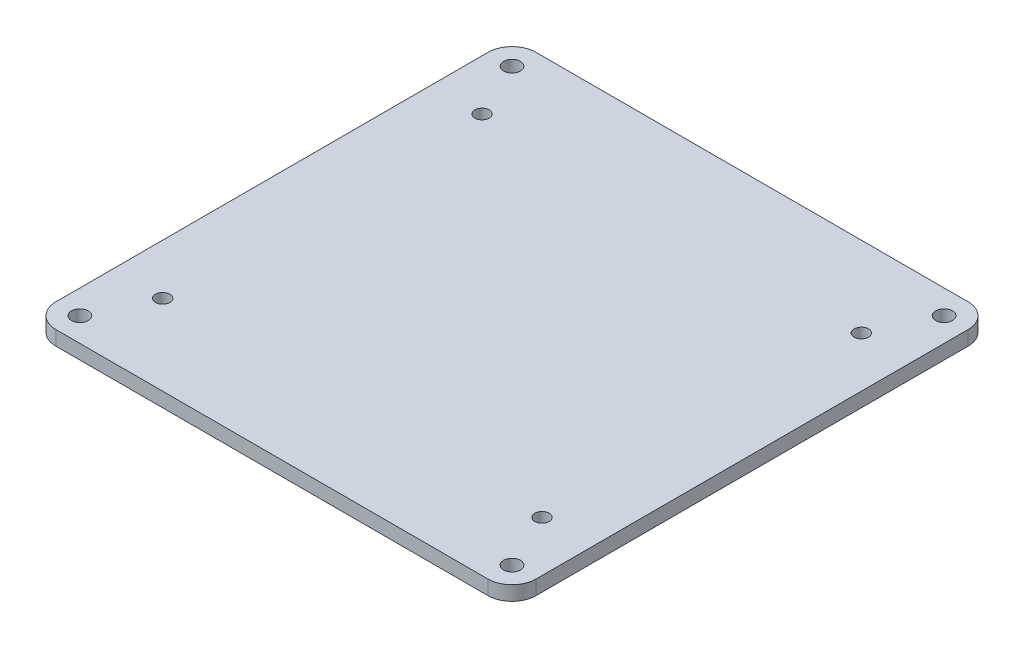
ISO-10303-21;
HEADER;
FILE_DESCRIPTION(('STEP AP214'),'2;1');
FILE_NAME('part.step','',(''),(''),'','','');
FILE_SCHEMA(('AUTOMOTIVE_DESIGN { 1 0 10303 214 1 1 1 1 }'));
ENDSEC;
DATA;
#1=APPLICATION_CONTEXT('core data for automotive mechanical design processes');
#2=APPLICATION_PROTOCOL_DEFINITION('international standard','automotive_design',2000,#1);
#3=PRODUCT_CONTEXT('',#1,'mechanical');
#4=PRODUCT('Part','Part','',(#3));
#5=PRODUCT_RELATED_PRODUCT_CATEGORY('part','',(#4));
#6=PRODUCT_DEFINITION_FORMATION('','',#4);
#7=PRODUCT_DEFINITION_CONTEXT('part definition',#1,'design');
#8=PRODUCT_DEFINITION('design','',#6,#7);
#9=PRODUCT_DEFINITION_SHAPE('','',#8);
#10=(LENGTH_UNIT() NAMED_UNIT(*) SI_UNIT(.MILLI.,.METRE.));
#11=(NAMED_UNIT(*) PLANE_ANGLE_UNIT() SI_UNIT($,.RADIAN.));
#12=(NAMED_UNIT(*) SI_UNIT($,.STERADIAN.) SOLID_ANGLE_UNIT());
#13=UNCERTAINTY_MEASURE_WITH_UNIT(LENGTH_MEASURE(1.E-05),#10,'distance_accuracy_value','');
#14=(GEOMETRIC_REPRESENTATION_CONTEXT(3) GLOBAL_UNCERTAINTY_ASSIGNED_CONTEXT((#13)) GLOBAL_UNIT_ASSIGNED_CONTEXT((#10,
#11,#12)) REPRESENTATION_CONTEXT('',''));
#15=CARTESIAN_POINT('',(0.,0.,0.));
#16=DIRECTION('',(0.,0.,1.));
#17=DIRECTION('',(1.,0.,0.));
#18=AXIS2_PLACEMENT_3D('',#15,#16,#17);
#19=CARTESIAN_POINT('',(45.,3.,45.));
#20=DIRECTION('',(0.,-1.,0.));
#21=DIRECTION('',(0.,0.,-1.));
#22=AXIS2_PLACEMENT_3D('',#19,#20,#21);
#23=PLANE('',#22);
#24=CARTESIAN_POINT('',(45.,3.,45.));
#25=DIRECTION('',(0.,1.,0.));
#26=DIRECTION('',(0.,0.,-1.));
#27=AXIS2_PLACEMENT_3D('',#24,#25,#26);
#28=CIRCLE('',#27,4.99999999999999);
#29=CARTESIAN_POINT('',(45.,3.,50.));
#30=VERTEX_POINT('',#29);
#31=CARTESIAN_POINT('',(50.,3.,45.));
#32=VERTEX_POINT('',#31);
#33=EDGE_CURVE('E147',#30,#32,#28,.T.);
#34=ORIENTED_EDGE('',*,*,#33,.T.);
#35=DIRECTION('',(0.,0.,-1.));
#36=VECTOR('',#35,1.);
#37=CARTESIAN_POINT('',(50.,3.,-45.));
#38=LINE('',#37,#36);
#39=CARTESIAN_POINT('',(50.,3.,-45.));
#40=VERTEX_POINT('',#39);
#41=EDGE_CURVE('E95',#32,#40,#38,.T.);
#42=ORIENTED_EDGE('',*,*,#41,.T.);
#43=CARTESIAN_POINT('',(45.,3.,-45.));
#44=DIRECTION('',(0.,1.,0.));
#45=DIRECTION('',(0.,0.,-1.));
#46=AXIS2_PLACEMENT_3D('',#43,#44,#45);
#47=CIRCLE('',#46,5.);
#48=CARTESIAN_POINT('',(45.,3.,-50.));
#49=VERTEX_POINT('',#48);
#50=EDGE_CURVE('E162',#40,#49,#47,.T.);
#51=ORIENTED_EDGE('',*,*,#50,.T.);
#52=DIRECTION('',(-1.,0.,0.));
#53=VECTOR('',#52,1.);
#54=CARTESIAN_POINT('',(-45.,3.,-50.));
#55=LINE('',#54,#53);
#56=CARTESIAN_POINT('',(-45.,3.,-50.));
#57=VERTEX_POINT('',#56);
#58=EDGE_CURVE('E175',#49,#57,#55,.T.);
#59=ORIENTED_EDGE('',*,*,#58,.T.);
#60=CARTESIAN_POINT('',(-45.,3.,-45.));
#61=DIRECTION('',(0.,1.,0.));
#62=DIRECTION('',(0.,0.,-1.));
#63=AXIS2_PLACEMENT_3D('',#60,#61,#62);
#64=CIRCLE('',#63,5.);
#65=CARTESIAN_POINT('',(-50.,3.,-45.));
#66=VERTEX_POINT('',#65);
#67=EDGE_CURVE('E114',#57,#66,#64,.T.);
#68=ORIENTED_EDGE('',*,*,#67,.T.);
#69=DIRECTION('',(0.,0.,1.));
#70=VECTOR('',#69,1.);
#71=CARTESIAN_POINT('',(-50.,3.,-45.));
#72=LINE('',#71,#70);
#73=CARTESIAN_POINT('',(-50.,3.,45.));
#74=VERTEX_POINT('',#73);
#75=EDGE_CURVE('E108',#66,#74,#72,.T.);
#76=ORIENTED_EDGE('',*,*,#75,.T.);
#77=CARTESIAN_POINT('',(-45.,3.,45.));
#78=DIRECTION('',(0.,1.,0.));
#79=DIRECTION('',(0.,0.,-1.));
#80=AXIS2_PLACEMENT_3D('',#77,#78,#79);
#81=CIRCLE('',#80,5.);
#82=CARTESIAN_POINT('',(-45.,3.,50.));
#83=VERTEX_POINT('',#82);
#84=EDGE_CURVE('E112',#74,#83,#81,.T.);
#85=ORIENTED_EDGE('',*,*,#84,.T.);
#86=DIRECTION('',(1.,0.,0.));
#87=VECTOR('',#86,1.);
#88=CARTESIAN_POINT('',(-45.,3.,50.));
#89=LINE('',#88,#87);
#90=EDGE_CURVE('E52',#83,#30,#89,.T.);
#91=ORIENTED_EDGE('',*,*,#90,.T.);
#92=EDGE_LOOP('',(#34,#42,#51,#59,#68,#76,#85,#91));
#93=FACE_BOUND('',#92,.T.);
#94=CARTESIAN_POINT('',(-45.,3.,-45.));
#95=DIRECTION('',(0.,1.,0.));
#96=DIRECTION('',(0.,0.,1.));
#97=AXIS2_PLACEMENT_3D('',#94,#95,#96);
#98=CIRCLE('',#97,1.75);
#99=CARTESIAN_POINT('',(-45.,3.,-43.25));
#100=VERTEX_POINT('',#99);
#101=EDGE_CURVE('E136',#100,#100,#98,.T.);
#102=ORIENTED_EDGE('',*,*,#101,.F.);
#103=EDGE_LOOP('',(#102));
#104=FACE_BOUND('',#103,.T.);
#105=CARTESIAN_POINT('',(45.,3.,-45.));
#106=DIRECTION('',(0.,1.,0.));
#107=DIRECTION('',(0.,0.,1.));
#108=AXIS2_PLACEMENT_3D('',#105,#106,#107);
#109=CIRCLE('',#108,1.75);
#110=CARTESIAN_POINT('',(45.,3.,-43.25));
#111=VERTEX_POINT('',#110);
#112=EDGE_CURVE('E184',#111,#111,#109,.T.);
#113=ORIENTED_EDGE('',*,*,#112,.F.);
#114=EDGE_LOOP('',(#113));
#115=FACE_BOUND('',#114,.T.);
#116=CARTESIAN_POINT('',(-45.,3.,45.));
#117=DIRECTION('',(0.,1.,0.));
#118=DIRECTION('',(0.,0.,1.));
#119=AXIS2_PLACEMENT_3D('',#116,#117,#118);
#120=CIRCLE('',#119,1.75);
#121=CARTESIAN_POINT('',(-45.,3.,46.75));
#122=VERTEX_POINT('',#121);
#123=EDGE_CURVE('E190',#122,#122,#120,.T.);
#124=ORIENTED_EDGE('',*,*,#123,.F.);
#125=EDGE_LOOP('',(#124));
#126=FACE_BOUND('',#125,.T.);
#127=CARTESIAN_POINT('',(45.,3.,45.));
#128=DIRECTION('',(0.,1.,0.));
#129=DIRECTION('',(0.,0.,1.));
#130=AXIS2_PLACEMENT_3D('',#127,#128,#129);
#131=CIRCLE('',#130,1.75);
#132=CARTESIAN_POINT('',(45.,3.,46.75));
#133=VERTEX_POINT('',#132);
#134=EDGE_CURVE('E196',#133,#133,#131,.T.);
#135=ORIENTED_EDGE('',*,*,#134,.F.);
#136=EDGE_LOOP('',(#135));
#137=FACE_BOUND('',#136,.T.);
#138=CARTESIAN_POINT('',(-39.5,3.,-33.25));
#139=DIRECTION('',(0.,1.,0.));
#140=DIRECTION('',(0.,0.,1.));
#141=AXIS2_PLACEMENT_3D('',#138,#139,#140);
#142=CIRCLE('',#141,1.5);
#143=CARTESIAN_POINT('',(-39.5,3.,-31.75));
#144=VERTEX_POINT('',#143);
#145=EDGE_CURVE('E202',#144,#144,#142,.T.);
#146=ORIENTED_EDGE('',*,*,#145,.F.);
#147=EDGE_LOOP('',(#146));
#148=FACE_BOUND('',#147,.T.);
#149=CARTESIAN_POINT('',(39.5,3.,-33.25));
#150=DIRECTION('',(0.,1.,0.));
#151=DIRECTION('',(0.,0.,1.));
#152=AXIS2_PLACEMENT_3D('',#149,#150,#151);
#153=CIRCLE('',#152,1.5);
#154=CARTESIAN_POINT('',(39.5,3.,-31.75));
#155=VERTEX_POINT('',#154);
#156=EDGE_CURVE('E208',#155,#155,#153,.T.);
#157=ORIENTED_EDGE('',*,*,#156,.F.);
#158=EDGE_LOOP('',(#157));
#159=FACE_BOUND('',#158,.T.);
#160=CARTESIAN_POINT('',(-39.5,3.,33.25));
#161=DIRECTION('',(0.,1.,0.));
#162=DIRECTION('',(0.,0.,1.));
#163=AXIS2_PLACEMENT_3D('',#160,#161,#162);
#164=CIRCLE('',#163,1.5);
#165=CARTESIAN_POINT('',(-39.5,3.,34.75));
#166=VERTEX_POINT('',#165);
#167=EDGE_CURVE('E214',#166,#166,#164,.T.);
#168=ORIENTED_EDGE('',*,*,#167,.F.);
#169=EDGE_LOOP('',(#168));
#170=FACE_BOUND('',#169,.T.);
#171=CARTESIAN_POINT('',(39.5,3.,33.25));
#172=DIRECTION('',(0.,1.,0.));
#173=DIRECTION('',(0.,0.,1.));
#174=AXIS2_PLACEMENT_3D('',#171,#172,#173);
#175=CIRCLE('',#174,1.5);
#176=CARTESIAN_POINT('',(39.5,3.,34.75));
#177=VERTEX_POINT('',#176);
#178=EDGE_CURVE('E220',#177,#177,#175,.T.);
#179=ORIENTED_EDGE('',*,*,#178,.F.);
#180=EDGE_LOOP('',(#179));
#181=FACE_BOUND('',#180,.T.);
#182=ADVANCED_FACE('F35',(#93,#104,#115,#126,#137,#148,#159,#170,#181),#23,.F.);
#183=CARTESIAN_POINT('',(45.,0.,45.));
#184=DIRECTION('',(0.,-1.,0.));
#185=DIRECTION('',(0.,0.,-1.));
#186=AXIS2_PLACEMENT_3D('',#183,#184,#185);
#187=PLANE('',#186);
#188=CARTESIAN_POINT('',(-39.5,0.,33.25));
#189=DIRECTION('',(0.,1.,0.));
#190=DIRECTION('',(0.,0.,1.));
#191=AXIS2_PLACEMENT_3D('',#188,#189,#190);
#192=CIRCLE('',#191,1.5);
#193=CARTESIAN_POINT('',(-39.5,0.,34.75));
#194=VERTEX_POINT('',#193);
#195=EDGE_CURVE('E217',#194,#194,#192,.T.);
#196=ORIENTED_EDGE('',*,*,#195,.T.);
#197=EDGE_LOOP('',(#196));
#198=FACE_BOUND('',#197,.T.);
#199=CARTESIAN_POINT('',(-39.5,0.,-33.25));
#200=DIRECTION('',(0.,1.,0.));
#201=DIRECTION('',(0.,0.,1.));
#202=AXIS2_PLACEMENT_3D('',#199,#200,#201);
#203=CIRCLE('',#202,1.5);
#204=CARTESIAN_POINT('',(-39.5,0.,-31.75));
#205=VERTEX_POINT('',#204);
#206=EDGE_CURVE('E205',#205,#205,#203,.T.);
#207=ORIENTED_EDGE('',*,*,#206,.T.);
#208=EDGE_LOOP('',(#207));
#209=FACE_BOUND('',#208,.T.);
#210=CARTESIAN_POINT('',(-45.,0.,45.));
#211=DIRECTION('',(0.,1.,0.));
#212=DIRECTION('',(0.,0.,1.));
#213=AXIS2_PLACEMENT_3D('',#210,#211,#212);
#214=CIRCLE('',#213,1.75);
#215=CARTESIAN_POINT('',(-45.,0.,46.75));
#216=VERTEX_POINT('',#215);
#217=EDGE_CURVE('E193',#216,#216,#214,.T.);
#218=ORIENTED_EDGE('',*,*,#217,.T.);
#219=EDGE_LOOP('',(#218));
#220=FACE_BOUND('',#219,.T.);
#221=CARTESIAN_POINT('',(-45.,0.,-45.));
#222=DIRECTION('',(0.,1.,0.));
#223=DIRECTION('',(0.,0.,1.));
#224=AXIS2_PLACEMENT_3D('',#221,#222,#223);
#225=CIRCLE('',#224,1.75);
#226=CARTESIAN_POINT('',(-45.,0.,-43.25));
#227=VERTEX_POINT('',#226);
#228=EDGE_CURVE('E181',#227,#227,#225,.T.);
#229=ORIENTED_EDGE('',*,*,#228,.T.);
#230=EDGE_LOOP('',(#229));
#231=FACE_BOUND('',#230,.T.);
#232=CARTESIAN_POINT('',(45.,0.,45.));
#233=DIRECTION('',(0.,1.,0.));
#234=DIRECTION('',(0.,0.,-1.));
#235=AXIS2_PLACEMENT_3D('',#232,#233,#234);
#236=CIRCLE('',#235,4.99999999999999);
#237=CARTESIAN_POINT('',(45.,0.,50.));
#238=VERTEX_POINT('',#237);
#239=CARTESIAN_POINT('',(50.,0.,45.));
#240=VERTEX_POINT('',#239);
#241=EDGE_CURVE('E132',#238,#240,#236,.T.);
#242=ORIENTED_EDGE('',*,*,#241,.F.);
#243=DIRECTION('',(1.,0.,0.));
#244=VECTOR('',#243,1.);
#245=CARTESIAN_POINT('',(-45.,0.,50.));
#246=LINE('',#245,#244);
#247=CARTESIAN_POINT('',(-45.,0.,50.));
#248=VERTEX_POINT('',#247);
#249=EDGE_CURVE('E87',#248,#238,#246,.T.);
#250=ORIENTED_EDGE('',*,*,#249,.F.);
#251=CARTESIAN_POINT('',(-45.,0.,45.));
#252=DIRECTION('',(0.,1.,0.));
#253=DIRECTION('',(0.,0.,-1.));
#254=AXIS2_PLACEMENT_3D('',#251,#252,#253);
#255=CIRCLE('',#254,5.);
#256=CARTESIAN_POINT('',(-50.,0.,45.));
#257=VERTEX_POINT('',#256);
#258=EDGE_CURVE('E81',#257,#248,#255,.T.);
#259=ORIENTED_EDGE('',*,*,#258,.F.);
#260=DIRECTION('',(0.,0.,1.));
#261=VECTOR('',#260,1.);
#262=CARTESIAN_POINT('',(-50.,0.,-45.));
#263=LINE('',#262,#261);
#264=CARTESIAN_POINT('',(-50.,0.,-45.));
#265=VERTEX_POINT('',#264);
#266=EDGE_CURVE('E122',#265,#257,#263,.T.);
#267=ORIENTED_EDGE('',*,*,#266,.F.);
#268=CARTESIAN_POINT('',(-45.,0.,-45.));
#269=DIRECTION('',(0.,1.,0.));
#270=DIRECTION('',(0.,0.,-1.));
#271=AXIS2_PLACEMENT_3D('',#268,#269,#270);
#272=CIRCLE('',#271,5.);
#273=CARTESIAN_POINT('',(-45.,0.,-50.));
#274=VERTEX_POINT('',#273);
#275=EDGE_CURVE('E142',#274,#265,#272,.T.);
#276=ORIENTED_EDGE('',*,*,#275,.F.);
#277=DIRECTION('',(-1.,0.,0.));
#278=VECTOR('',#277,1.);
#279=CARTESIAN_POINT('',(-45.,0.,-50.));
#280=LINE('',#279,#278);
#281=CARTESIAN_POINT('',(45.,0.,-50.));
#282=VERTEX_POINT('',#281);
#283=EDGE_CURVE('E140',#282,#274,#280,.T.);
#284=ORIENTED_EDGE('',*,*,#283,.F.);
#285=CARTESIAN_POINT('',(45.,0.,-45.));
#286=DIRECTION('',(0.,1.,0.));
#287=DIRECTION('',(0.,0.,-1.));
#288=AXIS2_PLACEMENT_3D('',#285,#286,#287);
#289=CIRCLE('',#288,5.);
#290=CARTESIAN_POINT('',(50.,0.,-45.));
#291=VERTEX_POINT('',#290);
#292=EDGE_CURVE('E138',#291,#282,#289,.T.);
#293=ORIENTED_EDGE('',*,*,#292,.F.);
#294=DIRECTION('',(0.,0.,-1.));
#295=VECTOR('',#294,1.);
#296=CARTESIAN_POINT('',(50.,0.,-45.));
#297=LINE('',#296,#295);
#298=EDGE_CURVE('E135',#240,#291,#297,.T.);
#299=ORIENTED_EDGE('',*,*,#298,.F.);
#300=EDGE_LOOP('',(#242,#250,#259,#267,#276,#284,#293,#299));
#301=FACE_BOUND('',#300,.T.);
#302=CARTESIAN_POINT('',(45.,0.,-45.));
#303=DIRECTION('',(0.,1.,0.));
#304=DIRECTION('',(0.,0.,1.));
#305=AXIS2_PLACEMENT_3D('',#302,#303,#304);
#306=CIRCLE('',#305,1.75);
#307=CARTESIAN_POINT('',(45.,0.,-43.25));
#308=VERTEX_POINT('',#307);
#309=EDGE_CURVE('E187',#308,#308,#306,.T.);
#310=ORIENTED_EDGE('',*,*,#309,.T.);
#311=EDGE_LOOP('',(#310));
#312=FACE_BOUND('',#311,.T.);
#313=CARTESIAN_POINT('',(45.,0.,45.));
#314=DIRECTION('',(0.,1.,0.));
#315=DIRECTION('',(0.,0.,1.));
#316=AXIS2_PLACEMENT_3D('',#313,#314,#315);
#317=CIRCLE('',#316,1.75);
#318=CARTESIAN_POINT('',(45.,0.,46.75));
#319=VERTEX_POINT('',#318);
#320=EDGE_CURVE('E199',#319,#319,#317,.T.);
#321=ORIENTED_EDGE('',*,*,#320,.T.);
#322=EDGE_LOOP('',(#321));
#323=FACE_BOUND('',#322,.T.);
#324=CARTESIAN_POINT('',(39.5,0.,-33.25));
#325=DIRECTION('',(0.,1.,0.));
#326=DIRECTION('',(0.,0.,1.));
#327=AXIS2_PLACEMENT_3D('',#324,#325,#326);
#328=CIRCLE('',#327,1.5);
#329=CARTESIAN_POINT('',(39.5,0.,-31.75));
#330=VERTEX_POINT('',#329);
#331=EDGE_CURVE('E211',#330,#330,#328,.T.);
#332=ORIENTED_EDGE('',*,*,#331,.T.);
#333=EDGE_LOOP('',(#332));
#334=FACE_BOUND('',#333,.T.);
#335=CARTESIAN_POINT('',(39.5,0.,33.25));
#336=DIRECTION('',(0.,1.,0.));
#337=DIRECTION('',(0.,0.,1.));
#338=AXIS2_PLACEMENT_3D('',#335,#336,#337);
#339=CIRCLE('',#338,1.5);
#340=CARTESIAN_POINT('',(39.5,0.,34.75));
#341=VERTEX_POINT('',#340);
#342=EDGE_CURVE('E223',#341,#341,#339,.T.);
#343=ORIENTED_EDGE('',*,*,#342,.T.);
#344=EDGE_LOOP('',(#343));
#345=FACE_BOUND('',#344,.T.);
#346=ADVANCED_FACE('F166',(#198,#209,#220,#231,#301,#312,#323,#334,#345),#187,.T.);
#347=CARTESIAN_POINT('',(45.,3.,45.));
#348=DIRECTION('',(0.,-1.,0.));
#349=DIRECTION('',(0.,0.,-1.));
#350=AXIS2_PLACEMENT_3D('',#347,#348,#349);
#351=CYLINDRICAL_SURFACE('',#350,4.99999999999999);
#352=ORIENTED_EDGE('',*,*,#241,.T.);
#353=DIRECTION('',(0.,-1.,0.));
#354=VECTOR('',#353,1.);
#355=CARTESIAN_POINT('',(50.,3.,45.));
#356=LINE('',#355,#354);
#357=EDGE_CURVE('E11',#32,#240,#356,.T.);
#358=ORIENTED_EDGE('',*,*,#357,.F.);
#359=ORIENTED_EDGE('',*,*,#33,.F.);
#360=DIRECTION('',(0.,-1.,0.));
#361=VECTOR('',#360,1.);
#362=CARTESIAN_POINT('',(45.,3.,50.));
#363=LINE('',#362,#361);
#364=EDGE_CURVE('E128',#30,#238,#363,.T.);
#365=ORIENTED_EDGE('',*,*,#364,.T.);
#366=EDGE_LOOP('',(#352,#358,#359,#365));
#367=FACE_BOUND('',#366,.T.);
#368=ADVANCED_FACE('F37',(#367),#351,.T.);
#369=CARTESIAN_POINT('',(50.,3.,-45.));
#370=DIRECTION('',(-1.,0.,0.));
#371=DIRECTION('',(0.,0.,1.));
#372=AXIS2_PLACEMENT_3D('',#369,#370,#371);
#373=PLANE('',#372);
#374=ORIENTED_EDGE('',*,*,#298,.T.);
#375=DIRECTION('',(0.,-1.,0.));
#376=VECTOR('',#375,1.);
#377=CARTESIAN_POINT('',(50.,3.,-45.));
#378=LINE('',#377,#376);
#379=EDGE_CURVE('E44',#40,#291,#378,.T.);
#380=ORIENTED_EDGE('',*,*,#379,.F.);
#381=ORIENTED_EDGE('',*,*,#41,.F.);
#382=ORIENTED_EDGE('',*,*,#357,.T.);
#383=EDGE_LOOP('',(#374,#380,#381,#382));
#384=FACE_BOUND('',#383,.T.);
#385=ADVANCED_FACE('F255',(#384),#373,.F.);
#386=CARTESIAN_POINT('',(45.,3.,-45.));
#387=DIRECTION('',(0.,-1.,0.));
#388=DIRECTION('',(0.,0.,-1.));
#389=AXIS2_PLACEMENT_3D('',#386,#387,#388);
#390=CYLINDRICAL_SURFACE('',#389,5.);
#391=ORIENTED_EDGE('',*,*,#292,.T.);
#392=DIRECTION('',(0.,-1.,0.));
#393=VECTOR('',#392,1.);
#394=CARTESIAN_POINT('',(45.,3.,-50.));
#395=LINE('',#394,#393);
#396=EDGE_CURVE('E154',#49,#282,#395,.T.);
#397=ORIENTED_EDGE('',*,*,#396,.F.);
#398=ORIENTED_EDGE('',*,*,#50,.F.);
#399=ORIENTED_EDGE('',*,*,#379,.T.);
#400=EDGE_LOOP('',(#391,#397,#398,#399));
#401=FACE_BOUND('',#400,.T.);
#402=ADVANCED_FACE('F160',(#401),#390,.T.);
#403=CARTESIAN_POINT('',(-45.,3.,-50.));
#404=DIRECTION('',(0.,0.,1.));
#405=DIRECTION('',(1.,0.,0.));
#406=AXIS2_PLACEMENT_3D('',#403,#404,#405);
#407=PLANE('',#406);
#408=ORIENTED_EDGE('',*,*,#283,.T.);
#409=DIRECTION('',(0.,-1.,0.));
#410=VECTOR('',#409,1.);
#411=CARTESIAN_POINT('',(-45.,3.,-50.));
#412=LINE('',#411,#410);
#413=EDGE_CURVE('E151',#57,#274,#412,.T.);
#414=ORIENTED_EDGE('',*,*,#413,.F.);
#415=ORIENTED_EDGE('',*,*,#58,.F.);
#416=ORIENTED_EDGE('',*,*,#396,.T.);
#417=EDGE_LOOP('',(#408,#414,#415,#416));
#418=FACE_BOUND('',#417,.T.);
#419=ADVANCED_FACE('F171',(#418),#407,.F.);
#420=CARTESIAN_POINT('',(-45.,3.,-45.));
#421=DIRECTION('',(0.,-1.,0.));
#422=DIRECTION('',(0.,0.,-1.));
#423=AXIS2_PLACEMENT_3D('',#420,#421,#422);
#424=CYLINDRICAL_SURFACE('',#423,5.);
#425=ORIENTED_EDGE('',*,*,#275,.T.);
#426=DIRECTION('',(0.,-1.,0.));
#427=VECTOR('',#426,1.);
#428=CARTESIAN_POINT('',(-50.,3.,-45.));
#429=LINE('',#428,#427);
#430=EDGE_CURVE('E123',#66,#265,#429,.T.);
#431=ORIENTED_EDGE('',*,*,#430,.F.);
#432=ORIENTED_EDGE('',*,*,#67,.F.);
#433=ORIENTED_EDGE('',*,*,#413,.T.);
#434=EDGE_LOOP('',(#425,#431,#432,#433));
#435=FACE_BOUND('',#434,.T.);
#436=ADVANCED_FACE('F174',(#435),#424,.T.);
#437=CARTESIAN_POINT('',(-50.,3.,-45.));
#438=DIRECTION('',(1.,0.,0.));
#439=DIRECTION('',(0.,0.,-1.));
#440=AXIS2_PLACEMENT_3D('',#437,#438,#439);
#441=PLANE('',#440);
#442=ORIENTED_EDGE('',*,*,#266,.T.);
#443=DIRECTION('',(0.,-1.,0.));
#444=VECTOR('',#443,1.);
#445=CARTESIAN_POINT('',(-50.,3.,45.));
#446=LINE('',#445,#444);
#447=EDGE_CURVE('E119',#74,#257,#446,.T.);
#448=ORIENTED_EDGE('',*,*,#447,.F.);
#449=ORIENTED_EDGE('',*,*,#75,.F.);
#450=ORIENTED_EDGE('',*,*,#430,.T.);
#451=EDGE_LOOP('',(#442,#448,#449,#450));
#452=FACE_BOUND('',#451,.T.);
#453=ADVANCED_FACE('F120',(#452),#441,.F.);
#454=CARTESIAN_POINT('',(-45.,3.,45.));
#455=DIRECTION('',(0.,-1.,0.));
#456=DIRECTION('',(0.,0.,-1.));
#457=AXIS2_PLACEMENT_3D('',#454,#455,#456);
#458=CYLINDRICAL_SURFACE('',#457,5.);
#459=ORIENTED_EDGE('',*,*,#258,.T.);
#460=DIRECTION('',(0.,-1.,0.));
#461=VECTOR('',#460,1.);
#462=CARTESIAN_POINT('',(-45.,3.,50.));
#463=LINE('',#462,#461);
#464=EDGE_CURVE('E124',#83,#248,#463,.T.);
#465=ORIENTED_EDGE('',*,*,#464,.F.);
#466=ORIENTED_EDGE('',*,*,#84,.F.);
#467=ORIENTED_EDGE('',*,*,#447,.T.);
#468=EDGE_LOOP('',(#459,#465,#466,#467));
#469=FACE_BOUND('',#468,.T.);
#470=ADVANCED_FACE('F126',(#469),#458,.T.);
#471=CARTESIAN_POINT('',(-45.,3.,50.));
#472=DIRECTION('',(0.,0.,-1.));
#473=DIRECTION('',(-1.,0.,0.));
#474=AXIS2_PLACEMENT_3D('',#471,#472,#473);
#475=PLANE('',#474);
#476=ORIENTED_EDGE('',*,*,#249,.T.);
#477=ORIENTED_EDGE('',*,*,#364,.F.);
#478=ORIENTED_EDGE('',*,*,#90,.F.);
#479=ORIENTED_EDGE('',*,*,#464,.T.);
#480=EDGE_LOOP('',(#476,#477,#478,#479));
#481=FACE_BOUND('',#480,.T.);
#482=ADVANCED_FACE('F243',(#481),#475,.F.);
#483=CARTESIAN_POINT('',(-45.,3.,-45.));
#484=DIRECTION('',(0.,-1.,0.));
#485=DIRECTION('',(0.,0.,-1.));
#486=AXIS2_PLACEMENT_3D('',#483,#484,#485);
#487=CYLINDRICAL_SURFACE('',#486,1.75);
#488=ORIENTED_EDGE('',*,*,#101,.T.);
#489=EDGE_LOOP('',(#488));
#490=FACE_BOUND('',#489,.T.);
#491=ORIENTED_EDGE('',*,*,#228,.F.);
#492=EDGE_LOOP('',(#491));
#493=FACE_BOUND('',#492,.T.);
#494=ADVANCED_FACE('F240',(#490,#493),#487,.F.);
#495=CARTESIAN_POINT('',(45.,3.,-45.));
#496=DIRECTION('',(0.,-1.,0.));
#497=DIRECTION('',(0.,0.,-1.));
#498=AXIS2_PLACEMENT_3D('',#495,#496,#497);
#499=CYLINDRICAL_SURFACE('',#498,1.75);
#500=ORIENTED_EDGE('',*,*,#112,.T.);
#501=EDGE_LOOP('',(#500));
#502=FACE_BOUND('',#501,.T.);
#503=ORIENTED_EDGE('',*,*,#309,.F.);
#504=EDGE_LOOP('',(#503));
#505=FACE_BOUND('',#504,.T.);
#506=ADVANCED_FACE('F319',(#502,#505),#499,.F.);
#507=CARTESIAN_POINT('',(-45.,3.,45.));
#508=DIRECTION('',(0.,-1.,0.));
#509=DIRECTION('',(0.,0.,-1.));
#510=AXIS2_PLACEMENT_3D('',#507,#508,#509);
#511=CYLINDRICAL_SURFACE('',#510,1.75);
#512=ORIENTED_EDGE('',*,*,#123,.T.);
#513=EDGE_LOOP('',(#512));
#514=FACE_BOUND('',#513,.T.);
#515=ORIENTED_EDGE('',*,*,#217,.F.);
#516=EDGE_LOOP('',(#515));
#517=FACE_BOUND('',#516,.T.);
#518=ADVANCED_FACE('F327',(#514,#517),#511,.F.);
#519=CARTESIAN_POINT('',(45.,3.,45.));
#520=DIRECTION('',(0.,-1.,0.));
#521=DIRECTION('',(0.,0.,-1.));
#522=AXIS2_PLACEMENT_3D('',#519,#520,#521);
#523=CYLINDRICAL_SURFACE('',#522,1.75);
#524=ORIENTED_EDGE('',*,*,#134,.T.);
#525=EDGE_LOOP('',(#524));
#526=FACE_BOUND('',#525,.T.);
#527=ORIENTED_EDGE('',*,*,#320,.F.);
#528=EDGE_LOOP('',(#527));
#529=FACE_BOUND('',#528,.T.);
#530=ADVANCED_FACE('F335',(#526,#529),#523,.F.);
#531=CARTESIAN_POINT('',(-39.5,3.,-33.25));
#532=DIRECTION('',(0.,-1.,0.));
#533=DIRECTION('',(0.,0.,-1.));
#534=AXIS2_PLACEMENT_3D('',#531,#532,#533);
#535=CYLINDRICAL_SURFACE('',#534,1.5);
#536=ORIENTED_EDGE('',*,*,#145,.T.);
#537=EDGE_LOOP('',(#536));
#538=FACE_BOUND('',#537,.T.);
#539=ORIENTED_EDGE('',*,*,#206,.F.);
#540=EDGE_LOOP('',(#539));
#541=FACE_BOUND('',#540,.T.);
#542=ADVANCED_FACE('F344',(#538,#541),#535,.F.);
#543=CARTESIAN_POINT('',(39.5,3.,-33.25));
#544=DIRECTION('',(0.,-1.,0.));
#545=DIRECTION('',(0.,0.,-1.));
#546=AXIS2_PLACEMENT_3D('',#543,#544,#545);
#547=CYLINDRICAL_SURFACE('',#546,1.5);
#548=ORIENTED_EDGE('',*,*,#156,.T.);
#549=EDGE_LOOP('',(#548));
#550=FACE_BOUND('',#549,.T.);
#551=ORIENTED_EDGE('',*,*,#331,.F.);
#552=EDGE_LOOP('',(#551));
#553=FACE_BOUND('',#552,.T.);
#554=ADVANCED_FACE('F353',(#550,#553),#547,.F.);
#555=CARTESIAN_POINT('',(-39.5,3.,33.25));
#556=DIRECTION('',(0.,-1.,0.));
#557=DIRECTION('',(0.,0.,-1.));
#558=AXIS2_PLACEMENT_3D('',#555,#556,#557);
#559=CYLINDRICAL_SURFACE('',#558,1.5);
#560=ORIENTED_EDGE('',*,*,#167,.T.);
#561=EDGE_LOOP('',(#560));
#562=FACE_BOUND('',#561,.T.);
#563=ORIENTED_EDGE('',*,*,#195,.F.);
#564=EDGE_LOOP('',(#563));
#565=FACE_BOUND('',#564,.T.);
#566=ADVANCED_FACE('F362',(#562,#565),#559,.F.);
#567=CARTESIAN_POINT('',(39.5,3.,33.25));
#568=DIRECTION('',(0.,-1.,0.));
#569=DIRECTION('',(0.,0.,-1.));
#570=AXIS2_PLACEMENT_3D('',#567,#568,#569);
#571=CYLINDRICAL_SURFACE('',#570,1.5);
#572=ORIENTED_EDGE('',*,*,#178,.T.);
#573=EDGE_LOOP('',(#572));
#574=FACE_BOUND('',#573,.T.);
#575=ORIENTED_EDGE('',*,*,#342,.F.);
#576=EDGE_LOOP('',(#575));
#577=FACE_BOUND('',#576,.T.);
#578=ADVANCED_FACE('F229',(#574,#577),#571,.F.);
#579=CLOSED_SHELL('',(#182,#346,#368,#385,#402,#419,#436,#453,#470,#482,#494,#506,#518,#530,
#542,#554,#566,#578));
#580=MANIFOLD_SOLID_BREP('B2',#579);
#581=ADVANCED_BREP_SHAPE_REPRESENTATION('',(#18,#580),#14);
#582=SHAPE_DEFINITION_REPRESENTATION(#9,#581);
ENDSEC;
END-ISO-10303-21;
